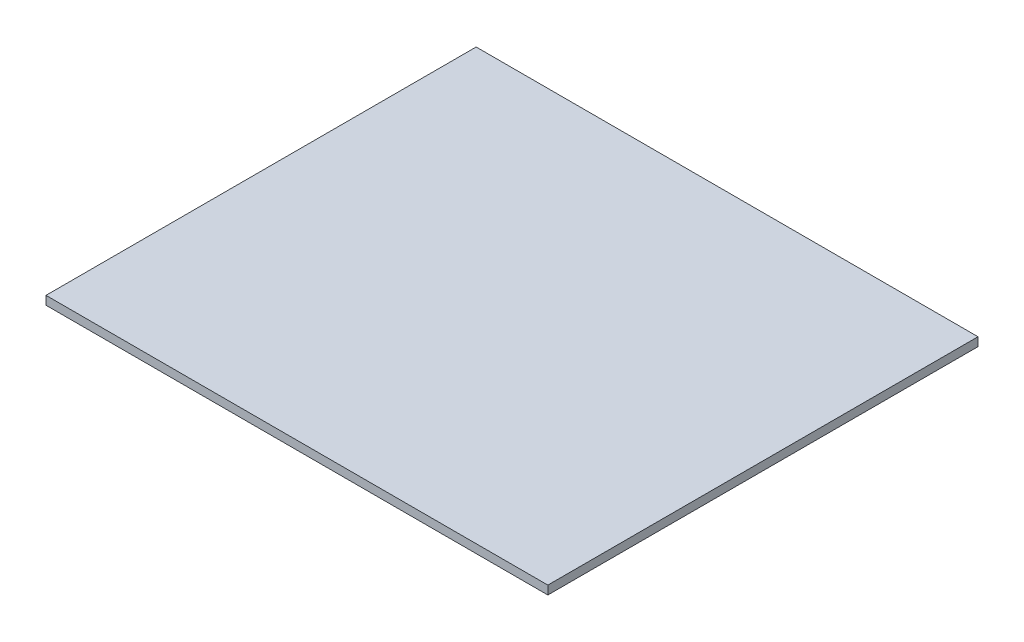
ISO-10303-21;
HEADER;
FILE_DESCRIPTION(('STEP AP214'),'2;1');
FILE_NAME('part.step','',(''),(''),'','','');
FILE_SCHEMA(('AUTOMOTIVE_DESIGN { 1 0 10303 214 1 1 1 1 }'));
ENDSEC;
DATA;
#1=APPLICATION_CONTEXT('core data for automotive mechanical design processes');
#2=APPLICATION_PROTOCOL_DEFINITION('international standard','automotive_design',2000,#1);
#3=PRODUCT_CONTEXT('',#1,'mechanical');
#4=PRODUCT('Part','Part','',(#3));
#5=PRODUCT_RELATED_PRODUCT_CATEGORY('part','',(#4));
#6=PRODUCT_DEFINITION_FORMATION('','',#4);
#7=PRODUCT_DEFINITION_CONTEXT('part definition',#1,'design');
#8=PRODUCT_DEFINITION('design','',#6,#7);
#9=PRODUCT_DEFINITION_SHAPE('','',#8);
#10=(LENGTH_UNIT() NAMED_UNIT(*) SI_UNIT(.MILLI.,.METRE.));
#11=(NAMED_UNIT(*) PLANE_ANGLE_UNIT() SI_UNIT($,.RADIAN.));
#12=(NAMED_UNIT(*) SI_UNIT($,.STERADIAN.) SOLID_ANGLE_UNIT());
#13=UNCERTAINTY_MEASURE_WITH_UNIT(LENGTH_MEASURE(1.E-05),#10,'distance_accuracy_value','');
#14=(GEOMETRIC_REPRESENTATION_CONTEXT(3) GLOBAL_UNCERTAINTY_ASSIGNED_CONTEXT((#13)) GLOBAL_UNIT_ASSIGNED_CONTEXT((#10,
#11,#12)) REPRESENTATION_CONTEXT('',''));
#15=CARTESIAN_POINT('',(0.,0.,0.));
#16=DIRECTION('',(0.,0.,1.));
#17=DIRECTION('',(1.,0.,0.));
#18=AXIS2_PLACEMENT_3D('',#15,#16,#17);
#19=CARTESIAN_POINT('',(-175.,6.,-150.));
#20=DIRECTION('',(1.,0.,0.));
#21=DIRECTION('',(0.,0.,-1.));
#22=AXIS2_PLACEMENT_3D('',#19,#20,#21);
#23=PLANE('',#22);
#24=DIRECTION('',(0.,0.,1.));
#25=VECTOR('',#24,1.);
#26=CARTESIAN_POINT('',(-175.,0.,-150.));
#27=LINE('',#26,#25);
#28=CARTESIAN_POINT('',(-175.,0.,-150.));
#29=VERTEX_POINT('',#28);
#30=CARTESIAN_POINT('',(-175.,0.,150.));
#31=VERTEX_POINT('',#30);
#32=EDGE_CURVE('E102',#29,#31,#27,.T.);
#33=ORIENTED_EDGE('',*,*,#32,.T.);
#34=DIRECTION('',(0.,-1.,0.));
#35=VECTOR('',#34,1.);
#36=CARTESIAN_POINT('',(-175.,6.,150.));
#37=LINE('',#36,#35);
#38=CARTESIAN_POINT('',(-175.,6.,150.));
#39=VERTEX_POINT('',#38);
#40=EDGE_CURVE('E11',#39,#31,#37,.T.);
#41=ORIENTED_EDGE('',*,*,#40,.F.);
#42=DIRECTION('',(0.,0.,1.));
#43=VECTOR('',#42,1.);
#44=CARTESIAN_POINT('',(-175.,6.,-150.));
#45=LINE('',#44,#43);
#46=CARTESIAN_POINT('',(-175.,6.,-150.));
#47=VERTEX_POINT('',#46);
#48=EDGE_CURVE('E88',#47,#39,#45,.T.);
#49=ORIENTED_EDGE('',*,*,#48,.F.);
#50=DIRECTION('',(0.,-1.,0.));
#51=VECTOR('',#50,1.);
#52=CARTESIAN_POINT('',(-175.,6.,-150.));
#53=LINE('',#52,#51);
#54=EDGE_CURVE('E55',#47,#29,#53,.T.);
#55=ORIENTED_EDGE('',*,*,#54,.T.);
#56=EDGE_LOOP('',(#33,#41,#49,#55));
#57=FACE_BOUND('',#56,.T.);
#58=ADVANCED_FACE('F39',(#57),#23,.F.);
#59=CARTESIAN_POINT('',(-175.,6.,150.));
#60=DIRECTION('',(0.,0.,-1.));
#61=DIRECTION('',(-1.,0.,0.));
#62=AXIS2_PLACEMENT_3D('',#59,#60,#61);
#63=PLANE('',#62);
#64=DIRECTION('',(1.,0.,0.));
#65=VECTOR('',#64,1.);
#66=CARTESIAN_POINT('',(-175.,0.,150.));
#67=LINE('',#66,#65);
#68=CARTESIAN_POINT('',(175.,0.,150.));
#69=VERTEX_POINT('',#68);
#70=EDGE_CURVE('E93',#31,#69,#67,.T.);
#71=ORIENTED_EDGE('',*,*,#70,.T.);
#72=DIRECTION('',(0.,-1.,0.));
#73=VECTOR('',#72,1.);
#74=CARTESIAN_POINT('',(175.,6.,150.));
#75=LINE('',#74,#73);
#76=CARTESIAN_POINT('',(175.,6.,150.));
#77=VERTEX_POINT('',#76);
#78=EDGE_CURVE('E47',#77,#69,#75,.T.);
#79=ORIENTED_EDGE('',*,*,#78,.F.);
#80=DIRECTION('',(1.,0.,0.));
#81=VECTOR('',#80,1.);
#82=CARTESIAN_POINT('',(-175.,6.,150.));
#83=LINE('',#82,#81);
#84=EDGE_CURVE('E80',#39,#77,#83,.T.);
#85=ORIENTED_EDGE('',*,*,#84,.F.);
#86=ORIENTED_EDGE('',*,*,#40,.T.);
#87=EDGE_LOOP('',(#71,#79,#85,#86));
#88=FACE_BOUND('',#87,.T.);
#89=ADVANCED_FACE('F92',(#88),#63,.F.);
#90=CARTESIAN_POINT('',(175.,6.,-150.));
#91=DIRECTION('',(1.,0.,0.));
#92=DIRECTION('',(0.,0.,-1.));
#93=AXIS2_PLACEMENT_3D('',#90,#91,#92);
#94=PLANE('',#93);
#95=DIRECTION('',(0.,0.,1.));
#96=VECTOR('',#95,1.);
#97=CARTESIAN_POINT('',(175.,0.,-150.));
#98=LINE('',#97,#96);
#99=CARTESIAN_POINT('',(175.,0.,-150.));
#100=VERTEX_POINT('',#99);
#101=EDGE_CURVE('E105',#100,#69,#98,.T.);
#102=ORIENTED_EDGE('',*,*,#101,.F.);
#103=DIRECTION('',(0.,-1.,0.));
#104=VECTOR('',#103,1.);
#105=CARTESIAN_POINT('',(175.,6.,-150.));
#106=LINE('',#105,#104);
#107=CARTESIAN_POINT('',(175.,6.,-150.));
#108=VERTEX_POINT('',#107);
#109=EDGE_CURVE('E69',#108,#100,#106,.T.);
#110=ORIENTED_EDGE('',*,*,#109,.F.);
#111=DIRECTION('',(0.,0.,1.));
#112=VECTOR('',#111,1.);
#113=CARTESIAN_POINT('',(175.,6.,-150.));
#114=LINE('',#113,#112);
#115=EDGE_CURVE('E87',#108,#77,#114,.T.);
#116=ORIENTED_EDGE('',*,*,#115,.T.);
#117=ORIENTED_EDGE('',*,*,#78,.T.);
#118=EDGE_LOOP('',(#102,#110,#116,#117));
#119=FACE_BOUND('',#118,.T.);
#120=ADVANCED_FACE('F96',(#119),#94,.T.);
#121=CARTESIAN_POINT('',(-175.,6.,-150.));
#122=DIRECTION('',(0.,0.,-1.));
#123=DIRECTION('',(-1.,0.,0.));
#124=AXIS2_PLACEMENT_3D('',#121,#122,#123);
#125=PLANE('',#124);
#126=DIRECTION('',(1.,0.,0.));
#127=VECTOR('',#126,1.);
#128=CARTESIAN_POINT('',(-175.,0.,-150.));
#129=LINE('',#128,#127);
#130=EDGE_CURVE('E107',#29,#100,#129,.T.);
#131=ORIENTED_EDGE('',*,*,#130,.F.);
#132=ORIENTED_EDGE('',*,*,#54,.F.);
#133=DIRECTION('',(1.,0.,0.));
#134=VECTOR('',#133,1.);
#135=CARTESIAN_POINT('',(-175.,6.,-150.));
#136=LINE('',#135,#134);
#137=EDGE_CURVE('E97',#47,#108,#136,.T.);
#138=ORIENTED_EDGE('',*,*,#137,.T.);
#139=ORIENTED_EDGE('',*,*,#109,.T.);
#140=EDGE_LOOP('',(#131,#132,#138,#139));
#141=FACE_BOUND('',#140,.T.);
#142=ADVANCED_FACE('F113',(#141),#125,.T.);
#143=CARTESIAN_POINT('',(0.,6.,0.));
#144=DIRECTION('',(0.,1.,0.));
#145=DIRECTION('',(0.,0.,1.));
#146=AXIS2_PLACEMENT_3D('',#143,#144,#145);
#147=PLANE('',#146);
#148=ORIENTED_EDGE('',*,*,#48,.T.);
#149=ORIENTED_EDGE('',*,*,#84,.T.);
#150=ORIENTED_EDGE('',*,*,#115,.F.);
#151=ORIENTED_EDGE('',*,*,#137,.F.);
#152=EDGE_LOOP('',(#148,#149,#150,#151));
#153=FACE_BOUND('',#152,.T.);
#154=ADVANCED_FACE('F84',(#153),#147,.T.);
#155=CARTESIAN_POINT('',(0.,0.,0.));
#156=DIRECTION('',(0.,1.,0.));
#157=DIRECTION('',(0.,0.,1.));
#158=AXIS2_PLACEMENT_3D('',#155,#156,#157);
#159=PLANE('',#158);
#160=ORIENTED_EDGE('',*,*,#32,.F.);
#161=ORIENTED_EDGE('',*,*,#130,.T.);
#162=ORIENTED_EDGE('',*,*,#101,.T.);
#163=ORIENTED_EDGE('',*,*,#70,.F.);
#164=EDGE_LOOP('',(#160,#161,#162,#163));
#165=FACE_BOUND('',#164,.T.);
#166=ADVANCED_FACE('F112',(#165),#159,.F.);
#167=CLOSED_SHELL('',(#58,#89,#120,#142,#154,#166));
#168=MANIFOLD_SOLID_BREP('B2',#167);
#169=ADVANCED_BREP_SHAPE_REPRESENTATION('',(#18,#168),#14);
#170=SHAPE_DEFINITION_REPRESENTATION(#9,#169);
ENDSEC;
END-ISO-10303-21;
